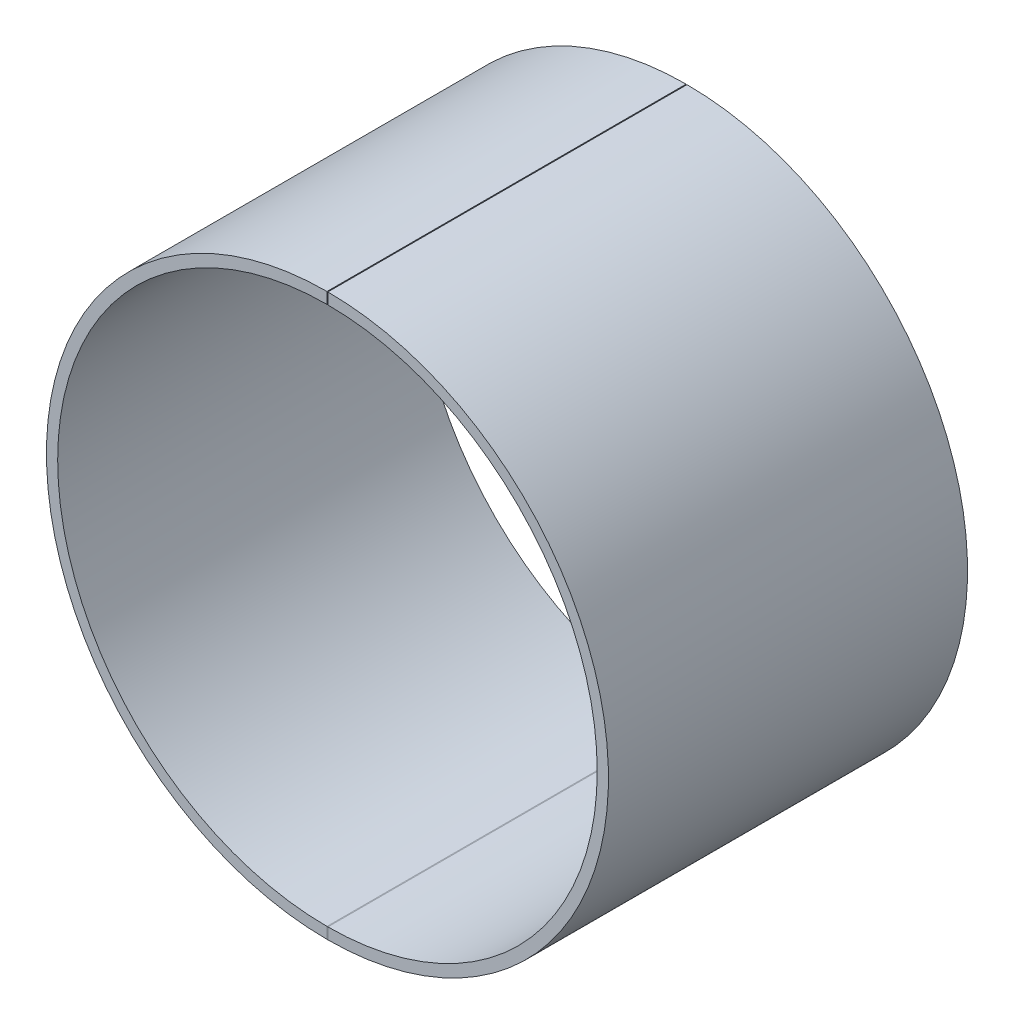
ISO-10303-21;
HEADER;
FILE_DESCRIPTION(('STEP AP214'),'2;1');
FILE_NAME('part.step','',(''),(''),'','','');
FILE_SCHEMA(('AUTOMOTIVE_DESIGN { 1 0 10303 214 1 1 1 1 }'));
ENDSEC;
DATA;
#1=APPLICATION_CONTEXT('core data for automotive mechanical design processes');
#2=APPLICATION_PROTOCOL_DEFINITION('international standard','automotive_design',2000,#1);
#3=PRODUCT_CONTEXT('',#1,'mechanical');
#4=PRODUCT('Part','Part','',(#3));
#5=PRODUCT_RELATED_PRODUCT_CATEGORY('part','',(#4));
#6=PRODUCT_DEFINITION_FORMATION('','',#4);
#7=PRODUCT_DEFINITION_CONTEXT('part definition',#1,'design');
#8=PRODUCT_DEFINITION('design','',#6,#7);
#9=PRODUCT_DEFINITION_SHAPE('','',#8);
#10=(LENGTH_UNIT() NAMED_UNIT(*) SI_UNIT(.MILLI.,.METRE.));
#11=(NAMED_UNIT(*) PLANE_ANGLE_UNIT() SI_UNIT($,.RADIAN.));
#12=(NAMED_UNIT(*) SI_UNIT($,.STERADIAN.) SOLID_ANGLE_UNIT());
#13=UNCERTAINTY_MEASURE_WITH_UNIT(LENGTH_MEASURE(1.E-05),#10,'distance_accuracy_value','');
#14=(GEOMETRIC_REPRESENTATION_CONTEXT(3) GLOBAL_UNCERTAINTY_ASSIGNED_CONTEXT((#13)) GLOBAL_UNIT_ASSIGNED_CONTEXT((#10,
#11,#12)) REPRESENTATION_CONTEXT('',''));
#15=CARTESIAN_POINT('',(0.,0.,0.));
#16=DIRECTION('',(0.,0.,1.));
#17=DIRECTION('',(1.,0.,0.));
#18=AXIS2_PLACEMENT_3D('',#15,#16,#17);
#19=CARTESIAN_POINT('',(0.254000000000001,-158.75,203.2));
#20=DIRECTION('',(0.,0.,1.));
#21=DIRECTION('',(1.,0.,0.));
#22=AXIS2_PLACEMENT_3D('',#19,#20,#21);
#23=PLANE('',#22);
#24=DIRECTION('',(0.,1.,0.));
#25=VECTOR('',#24,1.);
#26=CARTESIAN_POINT('',(0.254000000000001,-158.75,203.2));
#27=LINE('',#26,#25);
#28=CARTESIAN_POINT('',(0.254000000000001,-158.75,203.2));
#29=VERTEX_POINT('',#28);
#30=CARTESIAN_POINT('',(0.254000000000001,-152.4,203.2));
#31=VERTEX_POINT('',#30);
#32=EDGE_CURVE('E11',#29,#31,#27,.T.);
#33=ORIENTED_EDGE('',*,*,#32,.F.);
#34=CARTESIAN_POINT('',(0.254000000000029,0.,203.2));
#35=DIRECTION('',(0.,0.,1.));
#36=DIRECTION('',(1.,0.,0.));
#37=AXIS2_PLACEMENT_3D('',#34,#35,#36);
#38=CIRCLE('',#37,158.75);
#39=CARTESIAN_POINT('',(0.254000000000039,158.75,203.2));
#40=VERTEX_POINT('',#39);
#41=EDGE_CURVE('E130',#40,#29,#38,.F.);
#42=ORIENTED_EDGE('',*,*,#41,.F.);
#43=DIRECTION('',(0.,1.,0.));
#44=VECTOR('',#43,1.);
#45=CARTESIAN_POINT('',(0.254000000000038,152.4,203.2));
#46=LINE('',#45,#44);
#47=CARTESIAN_POINT('',(0.254000000000038,152.4,203.2));
#48=VERTEX_POINT('',#47);
#49=EDGE_CURVE('E112',#48,#40,#46,.T.);
#50=ORIENTED_EDGE('',*,*,#49,.F.);
#51=CARTESIAN_POINT('',(0.254000000000029,0.,203.2));
#52=DIRECTION('',(0.,0.,-1.));
#53=DIRECTION('',(1.,0.,0.));
#54=AXIS2_PLACEMENT_3D('',#51,#52,#53);
#55=CIRCLE('',#54,152.4);
#56=EDGE_CURVE('E121',#48,#31,#55,.T.);
#57=ORIENTED_EDGE('',*,*,#56,.T.);
#58=EDGE_LOOP('',(#33,#42,#50,#57));
#59=FACE_BOUND('',#58,.T.);
#60=ADVANCED_FACE('F36',(#59),#23,.T.);
#61=CARTESIAN_POINT('',(0.254000000000001,-152.4,0.));
#62=DIRECTION('',(0.,0.,-1.));
#63=DIRECTION('',(-1.,0.,0.));
#64=AXIS2_PLACEMENT_3D('',#61,#62,#63);
#65=PLANE('',#64);
#66=DIRECTION('',(0.,-1.,0.));
#67=VECTOR('',#66,1.);
#68=CARTESIAN_POINT('',(0.254000000000001,-152.4,0.));
#69=LINE('',#68,#67);
#70=CARTESIAN_POINT('',(0.254000000000001,-152.4,0.));
#71=VERTEX_POINT('',#70);
#72=CARTESIAN_POINT('',(0.254000000000001,-158.75,0.));
#73=VERTEX_POINT('',#72);
#74=EDGE_CURVE('E44',#71,#73,#69,.T.);
#75=ORIENTED_EDGE('',*,*,#74,.F.);
#76=CARTESIAN_POINT('',(0.254000000000029,0.,0.));
#77=DIRECTION('',(0.,0.,-1.));
#78=DIRECTION('',(1.,0.,0.));
#79=AXIS2_PLACEMENT_3D('',#76,#77,#78);
#80=CIRCLE('',#79,152.4);
#81=CARTESIAN_POINT('',(0.254000000000038,152.4,0.));
#82=VERTEX_POINT('',#81);
#83=EDGE_CURVE('E152',#82,#71,#80,.T.);
#84=ORIENTED_EDGE('',*,*,#83,.F.);
#85=DIRECTION('',(0.,1.,0.));
#86=VECTOR('',#85,1.);
#87=CARTESIAN_POINT('',(0.254000000000038,152.4,0.));
#88=LINE('',#87,#86);
#89=CARTESIAN_POINT('',(0.254000000000039,158.75,0.));
#90=VERTEX_POINT('',#89);
#91=EDGE_CURVE('E114',#82,#90,#88,.T.);
#92=ORIENTED_EDGE('',*,*,#91,.T.);
#93=CARTESIAN_POINT('',(0.254000000000029,0.,0.));
#94=DIRECTION('',(0.,0.,1.));
#95=DIRECTION('',(1.,0.,0.));
#96=AXIS2_PLACEMENT_3D('',#93,#94,#95);
#97=CIRCLE('',#96,158.75);
#98=EDGE_CURVE('E149',#90,#73,#97,.F.);
#99=ORIENTED_EDGE('',*,*,#98,.T.);
#100=EDGE_LOOP('',(#75,#84,#92,#99));
#101=FACE_BOUND('',#100,.T.);
#102=ADVANCED_FACE('F183',(#101),#65,.T.);
#103=CARTESIAN_POINT('',(-0.253999999999972,-152.4,203.2));
#104=DIRECTION('',(0.,0.,1.));
#105=DIRECTION('',(1.,0.,0.));
#106=AXIS2_PLACEMENT_3D('',#103,#104,#105);
#107=PLANE('',#106);
#108=DIRECTION('',(0.,-1.,0.));
#109=VECTOR('',#108,1.);
#110=CARTESIAN_POINT('',(-0.253999999999972,-152.4,203.2));
#111=LINE('',#110,#109);
#112=CARTESIAN_POINT('',(-0.253999999999972,-152.4,203.2));
#113=VERTEX_POINT('',#112);
#114=CARTESIAN_POINT('',(-0.254000000000058,-158.75,203.2));
#115=VERTEX_POINT('',#114);
#116=EDGE_CURVE('E52',#113,#115,#111,.T.);
#117=ORIENTED_EDGE('',*,*,#116,.F.);
#118=CARTESIAN_POINT('',(-0.254000000000029,0.,203.2));
#119=DIRECTION('',(0.,0.,-1.));
#120=DIRECTION('',(-1.,0.,0.));
#121=AXIS2_PLACEMENT_3D('',#118,#119,#120);
#122=CIRCLE('',#121,152.4);
#123=CARTESIAN_POINT('',(-0.254000000000038,152.4,203.2));
#124=VERTEX_POINT('',#123);
#125=EDGE_CURVE('E92',#113,#124,#122,.T.);
#126=ORIENTED_EDGE('',*,*,#125,.T.);
#127=DIRECTION('',(0.,-1.,0.));
#128=VECTOR('',#127,1.);
#129=CARTESIAN_POINT('',(-0.254000000000054,158.75,203.2));
#130=LINE('',#129,#128);
#131=CARTESIAN_POINT('',(-0.254000000000054,158.75,203.2));
#132=VERTEX_POINT('',#131);
#133=EDGE_CURVE('E191',#132,#124,#130,.T.);
#134=ORIENTED_EDGE('',*,*,#133,.F.);
#135=CARTESIAN_POINT('',(-0.254000000000029,0.,203.2));
#136=DIRECTION('',(0.,0.,1.));
#137=DIRECTION('',(1.,0.,0.));
#138=AXIS2_PLACEMENT_3D('',#135,#136,#137);
#139=CIRCLE('',#138,158.75);
#140=EDGE_CURVE('E189',#115,#132,#139,.F.);
#141=ORIENTED_EDGE('',*,*,#140,.F.);
#142=EDGE_LOOP('',(#117,#126,#134,#141));
#143=FACE_BOUND('',#142,.T.);
#144=ADVANCED_FACE('F199',(#143),#107,.T.);
#145=CARTESIAN_POINT('',(-0.254000000000058,-158.75,0.));
#146=DIRECTION('',(0.,0.,-1.));
#147=DIRECTION('',(-1.,0.,0.));
#148=AXIS2_PLACEMENT_3D('',#145,#146,#147);
#149=PLANE('',#148);
#150=DIRECTION('',(0.,1.,0.));
#151=VECTOR('',#150,1.);
#152=CARTESIAN_POINT('',(-0.254000000000058,-158.75,0.));
#153=LINE('',#152,#151);
#154=CARTESIAN_POINT('',(-0.254000000000058,-158.75,0.));
#155=VERTEX_POINT('',#154);
#156=CARTESIAN_POINT('',(-0.253999999999972,-152.4,0.));
#157=VERTEX_POINT('',#156);
#158=EDGE_CURVE('E86',#155,#157,#153,.T.);
#159=ORIENTED_EDGE('',*,*,#158,.F.);
#160=CARTESIAN_POINT('',(-0.254000000000029,0.,0.));
#161=DIRECTION('',(0.,0.,1.));
#162=DIRECTION('',(1.,0.,0.));
#163=AXIS2_PLACEMENT_3D('',#160,#161,#162);
#164=CIRCLE('',#163,158.75);
#165=CARTESIAN_POINT('',(-0.254000000000054,158.75,0.));
#166=VERTEX_POINT('',#165);
#167=EDGE_CURVE('E144',#155,#166,#164,.F.);
#168=ORIENTED_EDGE('',*,*,#167,.T.);
#169=DIRECTION('',(0.,-1.,0.));
#170=VECTOR('',#169,1.);
#171=CARTESIAN_POINT('',(-0.254000000000054,158.75,0.));
#172=LINE('',#171,#170);
#173=CARTESIAN_POINT('',(-0.254000000000038,152.4,0.));
#174=VERTEX_POINT('',#173);
#175=EDGE_CURVE('E141',#166,#174,#172,.T.);
#176=ORIENTED_EDGE('',*,*,#175,.T.);
#177=CARTESIAN_POINT('',(-0.254000000000029,0.,0.));
#178=DIRECTION('',(0.,0.,-1.));
#179=DIRECTION('',(-1.,0.,0.));
#180=AXIS2_PLACEMENT_3D('',#177,#178,#179);
#181=CIRCLE('',#180,152.4);
#182=EDGE_CURVE('E138',#157,#174,#181,.T.);
#183=ORIENTED_EDGE('',*,*,#182,.F.);
#184=EDGE_LOOP('',(#159,#168,#176,#183));
#185=FACE_BOUND('',#184,.T.);
#186=ADVANCED_FACE('F203',(#185),#149,.T.);
#187=CARTESIAN_POINT('',(-0.254000000000029,0.,203.2));
#188=DIRECTION('',(0.,0.,-1.));
#189=DIRECTION('',(-1.,0.,0.));
#190=AXIS2_PLACEMENT_3D('',#187,#188,#189);
#191=CYLINDRICAL_SURFACE('',#190,152.4);
#192=ORIENTED_EDGE('',*,*,#182,.T.);
#193=DIRECTION('',(0.,0.,-1.));
#194=VECTOR('',#193,1.);
#195=CARTESIAN_POINT('',(-0.254000000000038,152.4,203.2));
#196=LINE('',#195,#194);
#197=EDGE_CURVE('E168',#124,#174,#196,.T.);
#198=ORIENTED_EDGE('',*,*,#197,.F.);
#199=ORIENTED_EDGE('',*,*,#125,.F.);
#200=DIRECTION('',(0.,0.,-1.));
#201=VECTOR('',#200,1.);
#202=CARTESIAN_POINT('',(-0.253999999999972,-152.4,203.2));
#203=LINE('',#202,#201);
#204=EDGE_CURVE('E137',#113,#157,#203,.T.);
#205=ORIENTED_EDGE('',*,*,#204,.T.);
#206=EDGE_LOOP('',(#192,#198,#199,#205));
#207=FACE_BOUND('',#206,.T.);
#208=ADVANCED_FACE('F206',(#207),#191,.F.);
#209=CARTESIAN_POINT('',(-0.254000000000054,158.75,203.2));
#210=DIRECTION('',(1.,0.,0.));
#211=DIRECTION('',(0.,1.,0.));
#212=AXIS2_PLACEMENT_3D('',#209,#210,#211);
#213=PLANE('',#212);
#214=ORIENTED_EDGE('',*,*,#175,.F.);
#215=DIRECTION('',(0.,0.,-1.));
#216=VECTOR('',#215,1.);
#217=CARTESIAN_POINT('',(-0.254000000000054,158.75,203.2));
#218=LINE('',#217,#216);
#219=EDGE_CURVE('E166',#132,#166,#218,.T.);
#220=ORIENTED_EDGE('',*,*,#219,.F.);
#221=ORIENTED_EDGE('',*,*,#133,.T.);
#222=ORIENTED_EDGE('',*,*,#197,.T.);
#223=EDGE_LOOP('',(#214,#220,#221,#222));
#224=FACE_BOUND('',#223,.T.);
#225=ADVANCED_FACE('F198',(#224),#213,.T.);
#226=CARTESIAN_POINT('',(-0.254000000000029,0.,203.2));
#227=DIRECTION('',(0.,0.,-1.));
#228=DIRECTION('',(-1.,0.,0.));
#229=AXIS2_PLACEMENT_3D('',#226,#227,#228);
#230=CYLINDRICAL_SURFACE('',#229,158.75);
#231=ORIENTED_EDGE('',*,*,#167,.F.);
#232=DIRECTION('',(0.,0.,-1.));
#233=VECTOR('',#232,1.);
#234=CARTESIAN_POINT('',(-0.254000000000058,-158.75,203.2));
#235=LINE('',#234,#233);
#236=EDGE_CURVE('E163',#115,#155,#235,.T.);
#237=ORIENTED_EDGE('',*,*,#236,.F.);
#238=ORIENTED_EDGE('',*,*,#140,.T.);
#239=ORIENTED_EDGE('',*,*,#219,.T.);
#240=EDGE_LOOP('',(#231,#237,#238,#239));
#241=FACE_BOUND('',#240,.T.);
#242=ADVANCED_FACE('F201',(#241),#230,.T.);
#243=CARTESIAN_POINT('',(-0.253999999999972,-158.75,203.2));
#244=DIRECTION('',(0.,-1.,0.));
#245=DIRECTION('',(0.,0.,-1.));
#246=AXIS2_PLACEMENT_3D('',#243,#244,#245);
#247=PLANE('',#246);
#248=DIRECTION('',(1.,0.,0.));
#249=VECTOR('',#248,1.);
#250=CARTESIAN_POINT('',(-0.253999999999972,-158.75,0.));
#251=LINE('',#250,#249);
#252=EDGE_CURVE('E147',#73,#155,#251,.F.);
#253=ORIENTED_EDGE('',*,*,#252,.F.);
#254=DIRECTION('',(0.,0.,-1.));
#255=VECTOR('',#254,1.);
#256=CARTESIAN_POINT('',(0.254000000000001,-158.75,203.2));
#257=LINE('',#256,#255);
#258=EDGE_CURVE('E160',#29,#73,#257,.T.);
#259=ORIENTED_EDGE('',*,*,#258,.F.);
#260=DIRECTION('',(1.,0.,0.));
#261=VECTOR('',#260,1.);
#262=CARTESIAN_POINT('',(-0.253999999999972,-158.75,203.2));
#263=LINE('',#262,#261);
#264=EDGE_CURVE('E132',#29,#115,#263,.F.);
#265=ORIENTED_EDGE('',*,*,#264,.T.);
#266=ORIENTED_EDGE('',*,*,#236,.T.);
#267=EDGE_LOOP('',(#253,#259,#265,#266));
#268=FACE_BOUND('',#267,.T.);
#269=ADVANCED_FACE('F180',(#268),#247,.T.);
#270=CARTESIAN_POINT('',(0.254000000000029,0.,203.2));
#271=DIRECTION('',(0.,0.,-1.));
#272=DIRECTION('',(-1.,0.,0.));
#273=AXIS2_PLACEMENT_3D('',#270,#271,#272);
#274=CYLINDRICAL_SURFACE('',#273,158.75);
#275=ORIENTED_EDGE('',*,*,#98,.F.);
#276=DIRECTION('',(0.,0.,-1.));
#277=VECTOR('',#276,1.);
#278=CARTESIAN_POINT('',(0.254000000000039,158.75,203.2));
#279=LINE('',#278,#277);
#280=EDGE_CURVE('E116',#40,#90,#279,.T.);
#281=ORIENTED_EDGE('',*,*,#280,.F.);
#282=ORIENTED_EDGE('',*,*,#41,.T.);
#283=ORIENTED_EDGE('',*,*,#258,.T.);
#284=EDGE_LOOP('',(#275,#281,#282,#283));
#285=FACE_BOUND('',#284,.T.);
#286=ADVANCED_FACE('F176',(#285),#274,.T.);
#287=CARTESIAN_POINT('',(0.254000000000038,152.4,203.2));
#288=DIRECTION('',(-1.,0.,0.));
#289=DIRECTION('',(0.,-1.,0.));
#290=AXIS2_PLACEMENT_3D('',#287,#288,#289);
#291=PLANE('',#290);
#292=ORIENTED_EDGE('',*,*,#91,.F.);
#293=DIRECTION('',(0.,0.,-1.));
#294=VECTOR('',#293,1.);
#295=CARTESIAN_POINT('',(0.254000000000038,152.4,203.2));
#296=LINE('',#295,#294);
#297=EDGE_CURVE('E108',#48,#82,#296,.T.);
#298=ORIENTED_EDGE('',*,*,#297,.F.);
#299=ORIENTED_EDGE('',*,*,#49,.T.);
#300=ORIENTED_EDGE('',*,*,#280,.T.);
#301=EDGE_LOOP('',(#292,#298,#299,#300));
#302=FACE_BOUND('',#301,.T.);
#303=ADVANCED_FACE('F110',(#302),#291,.T.);
#304=CARTESIAN_POINT('',(0.254000000000029,0.,203.2));
#305=DIRECTION('',(0.,0.,-1.));
#306=DIRECTION('',(-1.,0.,0.));
#307=AXIS2_PLACEMENT_3D('',#304,#305,#306);
#308=CYLINDRICAL_SURFACE('',#307,152.4);
#309=ORIENTED_EDGE('',*,*,#83,.T.);
#310=DIRECTION('',(0.,0.,-1.));
#311=VECTOR('',#310,1.);
#312=CARTESIAN_POINT('',(0.254000000000001,-152.4,203.2));
#313=LINE('',#312,#311);
#314=EDGE_CURVE('E117',#31,#71,#313,.T.);
#315=ORIENTED_EDGE('',*,*,#314,.F.);
#316=ORIENTED_EDGE('',*,*,#56,.F.);
#317=ORIENTED_EDGE('',*,*,#297,.T.);
#318=EDGE_LOOP('',(#309,#315,#316,#317));
#319=FACE_BOUND('',#318,.T.);
#320=ADVANCED_FACE('F122',(#319),#308,.F.);
#321=CARTESIAN_POINT('',(-0.253999999999972,-152.4,203.2));
#322=DIRECTION('',(0.,-1.,0.));
#323=DIRECTION('',(0.,0.,-1.));
#324=AXIS2_PLACEMENT_3D('',#321,#322,#323);
#325=PLANE('',#324);
#326=DIRECTION('',(-1.,0.,0.));
#327=VECTOR('',#326,1.);
#328=CARTESIAN_POINT('',(-0.253999999999972,-152.4,0.));
#329=LINE('',#328,#327);
#330=EDGE_CURVE('E154',#71,#157,#329,.T.);
#331=ORIENTED_EDGE('',*,*,#330,.T.);
#332=ORIENTED_EDGE('',*,*,#204,.F.);
#333=DIRECTION('',(-1.,0.,0.));
#334=VECTOR('',#333,1.);
#335=CARTESIAN_POINT('',(-0.253999999999972,-152.4,203.2));
#336=LINE('',#335,#334);
#337=EDGE_CURVE('E126',#31,#113,#336,.T.);
#338=ORIENTED_EDGE('',*,*,#337,.F.);
#339=ORIENTED_EDGE('',*,*,#314,.T.);
#340=EDGE_LOOP('',(#331,#332,#338,#339));
#341=FACE_BOUND('',#340,.T.);
#342=ADVANCED_FACE('F185',(#341),#325,.F.);
#343=CARTESIAN_POINT('',(-0.254000000000029,0.,203.2));
#344=DIRECTION('',(0.,0.,-1.));
#345=DIRECTION('',(-1.,0.,0.));
#346=AXIS2_PLACEMENT_3D('',#343,#344,#345);
#347=PLANE('',#346);
#348=ORIENTED_EDGE('',*,*,#337,.T.);
#349=ORIENTED_EDGE('',*,*,#116,.T.);
#350=ORIENTED_EDGE('',*,*,#264,.F.);
#351=ORIENTED_EDGE('',*,*,#32,.T.);
#352=EDGE_LOOP('',(#348,#349,#350,#351));
#353=FACE_BOUND('',#352,.T.);
#354=ADVANCED_FACE('F188',(#353),#347,.F.);
#355=CARTESIAN_POINT('',(-0.254000000000029,0.,0.));
#356=DIRECTION('',(0.,0.,-1.));
#357=DIRECTION('',(-1.,0.,0.));
#358=AXIS2_PLACEMENT_3D('',#355,#356,#357);
#359=PLANE('',#358);
#360=ORIENTED_EDGE('',*,*,#252,.T.);
#361=ORIENTED_EDGE('',*,*,#158,.T.);
#362=ORIENTED_EDGE('',*,*,#330,.F.);
#363=ORIENTED_EDGE('',*,*,#74,.T.);
#364=EDGE_LOOP('',(#360,#361,#362,#363));
#365=FACE_BOUND('',#364,.T.);
#366=ADVANCED_FACE('F171',(#365),#359,.T.);
#367=CLOSED_SHELL('',(#60,#102,#144,#186,#208,#225,#242,#269,#286,#303,#320,#342,#354,#366));
#368=MANIFOLD_SOLID_BREP('B2',#367);
#369=ADVANCED_BREP_SHAPE_REPRESENTATION('',(#18,#368),#14);
#370=SHAPE_DEFINITION_REPRESENTATION(#9,#369);
ENDSEC;
END-ISO-10303-21;
